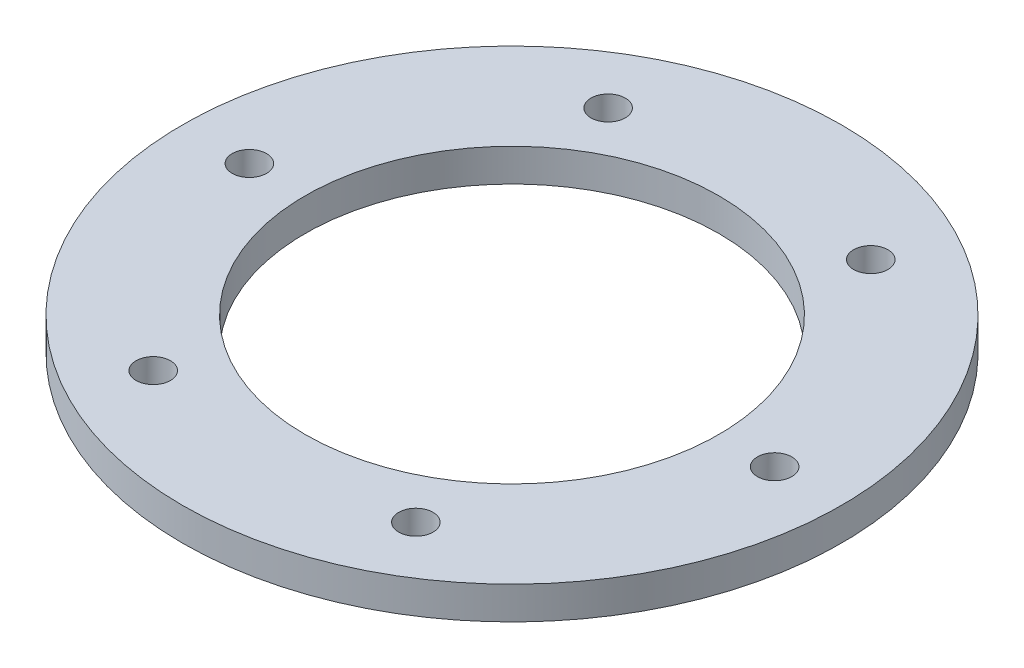
ISO-10303-21;
HEADER;
FILE_DESCRIPTION(('STEP AP214'),'2;1');
FILE_NAME('part.step','',(''),(''),'','','');
FILE_SCHEMA(('AUTOMOTIVE_DESIGN { 1 0 10303 214 1 1 1 1 }'));
ENDSEC;
DATA;
#1=APPLICATION_CONTEXT('core data for automotive mechanical design processes');
#2=APPLICATION_PROTOCOL_DEFINITION('international standard','automotive_design',2000,#1);
#3=PRODUCT_CONTEXT('',#1,'mechanical');
#4=PRODUCT('Part','Part','',(#3));
#5=PRODUCT_RELATED_PRODUCT_CATEGORY('part','',(#4));
#6=PRODUCT_DEFINITION_FORMATION('','',#4);
#7=PRODUCT_DEFINITION_CONTEXT('part definition',#1,'design');
#8=PRODUCT_DEFINITION('design','',#6,#7);
#9=PRODUCT_DEFINITION_SHAPE('','',#8);
#10=(LENGTH_UNIT() NAMED_UNIT(*) SI_UNIT(.MILLI.,.METRE.));
#11=(NAMED_UNIT(*) PLANE_ANGLE_UNIT() SI_UNIT($,.RADIAN.));
#12=(NAMED_UNIT(*) SI_UNIT($,.STERADIAN.) SOLID_ANGLE_UNIT());
#13=UNCERTAINTY_MEASURE_WITH_UNIT(LENGTH_MEASURE(1.E-05),#10,'distance_accuracy_value','');
#14=(GEOMETRIC_REPRESENTATION_CONTEXT(3) GLOBAL_UNCERTAINTY_ASSIGNED_CONTEXT((#13)) GLOBAL_UNIT_ASSIGNED_CONTEXT((#10,
#11,#12)) REPRESENTATION_CONTEXT('',''));
#15=CARTESIAN_POINT('',(0.,0.,0.));
#16=DIRECTION('',(0.,0.,1.));
#17=DIRECTION('',(1.,0.,0.));
#18=AXIS2_PLACEMENT_3D('',#15,#16,#17);
#19=CARTESIAN_POINT('',(0.,0.,0.));
#20=DIRECTION('',(0.,-1.,0.));
#21=DIRECTION('',(0.,0.,-1.));
#22=AXIS2_PLACEMENT_3D('',#19,#20,#21);
#23=CYLINDRICAL_SURFACE('',#22,25.28);
#24=CARTESIAN_POINT('',(0.,0.,0.));
#25=DIRECTION('',(0.,-1.,0.));
#26=DIRECTION('',(0.,0.,-1.));
#27=AXIS2_PLACEMENT_3D('',#24,#25,#26);
#28=CIRCLE('',#27,25.28);
#29=CARTESIAN_POINT('',(0.,0.,-25.28));
#30=VERTEX_POINT('',#29);
#31=EDGE_CURVE('E72',#30,#30,#28,.T.);
#32=ORIENTED_EDGE('',*,*,#31,.T.);
#33=EDGE_LOOP('',(#32));
#34=FACE_BOUND('',#33,.T.);
#35=CARTESIAN_POINT('',(0.,4.,0.));
#36=DIRECTION('',(0.,-1.,0.));
#37=DIRECTION('',(0.,0.,-1.));
#38=AXIS2_PLACEMENT_3D('',#35,#36,#37);
#39=CIRCLE('',#38,25.28);
#40=CARTESIAN_POINT('',(0.,4.,-25.28));
#41=VERTEX_POINT('',#40);
#42=EDGE_CURVE('E10',#41,#41,#39,.T.);
#43=ORIENTED_EDGE('',*,*,#42,.F.);
#44=EDGE_LOOP('',(#43));
#45=FACE_BOUND('',#44,.T.);
#46=ADVANCED_FACE('F39',(#34,#45),#23,.F.);
#47=CARTESIAN_POINT('',(25.28,4.,0.));
#48=DIRECTION('',(0.,1.,0.));
#49=DIRECTION('',(0.,0.,1.));
#50=AXIS2_PLACEMENT_3D('',#47,#48,#49);
#51=PLANE('',#50);
#52=CARTESIAN_POINT('',(-32.1,4.,0.));
#53=DIRECTION('',(0.,1.,0.));
#54=DIRECTION('',(0.,0.,1.));
#55=AXIS2_PLACEMENT_3D('',#52,#53,#54);
#56=CIRCLE('',#55,2.1);
#57=CARTESIAN_POINT('',(-32.1,4.,2.1));
#58=VERTEX_POINT('',#57);
#59=EDGE_CURVE('E59',#58,#58,#56,.T.);
#60=ORIENTED_EDGE('',*,*,#59,.F.);
#61=EDGE_LOOP('',(#60));
#62=FACE_BOUND('',#61,.T.);
#63=CARTESIAN_POINT('',(-16.05,4.,27.7994154614805));
#64=DIRECTION('',(0.,1.,0.));
#65=DIRECTION('',(0.,0.,1.));
#66=AXIS2_PLACEMENT_3D('',#63,#64,#65);
#67=CIRCLE('',#66,2.1);
#68=CARTESIAN_POINT('',(-16.05,4.,29.8994154614805));
#69=VERTEX_POINT('',#68);
#70=EDGE_CURVE('E85',#69,#69,#67,.T.);
#71=ORIENTED_EDGE('',*,*,#70,.F.);
#72=EDGE_LOOP('',(#71));
#73=FACE_BOUND('',#72,.T.);
#74=CARTESIAN_POINT('',(16.05,4.,27.7994154614805));
#75=DIRECTION('',(0.,1.,0.));
#76=DIRECTION('',(0.,0.,1.));
#77=AXIS2_PLACEMENT_3D('',#74,#75,#76);
#78=CIRCLE('',#77,2.1);
#79=CARTESIAN_POINT('',(16.05,4.,29.8994154614805));
#80=VERTEX_POINT('',#79);
#81=EDGE_CURVE('E81',#80,#80,#78,.T.);
#82=ORIENTED_EDGE('',*,*,#81,.F.);
#83=EDGE_LOOP('',(#82));
#84=FACE_BOUND('',#83,.T.);
#85=CARTESIAN_POINT('',(32.1,4.,0.));
#86=DIRECTION('',(0.,1.,0.));
#87=DIRECTION('',(0.,0.,1.));
#88=AXIS2_PLACEMENT_3D('',#85,#86,#87);
#89=CIRCLE('',#88,2.09999999999999);
#90=CARTESIAN_POINT('',(32.1,4.,2.09999999999999));
#91=VERTEX_POINT('',#90);
#92=EDGE_CURVE('E84',#91,#91,#89,.T.);
#93=ORIENTED_EDGE('',*,*,#92,.F.);
#94=EDGE_LOOP('',(#93));
#95=FACE_BOUND('',#94,.T.);
#96=CARTESIAN_POINT('',(16.05,4.,-27.7994154614805));
#97=DIRECTION('',(0.,1.,0.));
#98=DIRECTION('',(0.,0.,1.));
#99=AXIS2_PLACEMENT_3D('',#96,#97,#98);
#100=CIRCLE('',#99,2.1);
#101=CARTESIAN_POINT('',(16.05,4.,-25.6994154614805));
#102=VERTEX_POINT('',#101);
#103=EDGE_CURVE('E88',#102,#102,#100,.T.);
#104=ORIENTED_EDGE('',*,*,#103,.F.);
#105=EDGE_LOOP('',(#104));
#106=FACE_BOUND('',#105,.T.);
#107=CARTESIAN_POINT('',(-16.05,4.,-27.7994154614805));
#108=DIRECTION('',(0.,1.,0.));
#109=DIRECTION('',(0.,0.,1.));
#110=AXIS2_PLACEMENT_3D('',#107,#108,#109);
#111=CIRCLE('',#110,2.1);
#112=CARTESIAN_POINT('',(-16.05,4.,-25.6994154614805));
#113=VERTEX_POINT('',#112);
#114=EDGE_CURVE('E91',#113,#113,#111,.T.);
#115=ORIENTED_EDGE('',*,*,#114,.F.);
#116=EDGE_LOOP('',(#115));
#117=FACE_BOUND('',#116,.T.);
#118=ORIENTED_EDGE('',*,*,#42,.T.);
#119=EDGE_LOOP('',(#118));
#120=FACE_BOUND('',#119,.T.);
#121=CARTESIAN_POINT('',(0.,4.,0.));
#122=DIRECTION('',(0.,-1.,0.));
#123=DIRECTION('',(0.,0.,-1.));
#124=AXIS2_PLACEMENT_3D('',#121,#122,#123);
#125=CIRCLE('',#124,40.28);
#126=CARTESIAN_POINT('',(0.,4.,-40.28));
#127=VERTEX_POINT('',#126);
#128=EDGE_CURVE('E46',#127,#127,#125,.T.);
#129=ORIENTED_EDGE('',*,*,#128,.F.);
#130=EDGE_LOOP('',(#129));
#131=FACE_BOUND('',#130,.T.);
#132=ADVANCED_FACE('F101',(#62,#73,#84,#95,#106,#117,#120,#131),#51,.T.);
#133=CARTESIAN_POINT('',(0.,0.,0.));
#134=DIRECTION('',(0.,-1.,0.));
#135=DIRECTION('',(0.,0.,-1.));
#136=AXIS2_PLACEMENT_3D('',#133,#134,#135);
#137=CYLINDRICAL_SURFACE('',#136,40.28);
#138=ORIENTED_EDGE('',*,*,#128,.T.);
#139=EDGE_LOOP('',(#138));
#140=FACE_BOUND('',#139,.T.);
#141=CARTESIAN_POINT('',(0.,0.,0.));
#142=DIRECTION('',(0.,-1.,0.));
#143=DIRECTION('',(0.,0.,-1.));
#144=AXIS2_PLACEMENT_3D('',#141,#142,#143);
#145=CIRCLE('',#144,40.28);
#146=CARTESIAN_POINT('',(0.,0.,-40.28));
#147=VERTEX_POINT('',#146);
#148=EDGE_CURVE('E51',#147,#147,#145,.T.);
#149=ORIENTED_EDGE('',*,*,#148,.F.);
#150=EDGE_LOOP('',(#149));
#151=FACE_BOUND('',#150,.T.);
#152=ADVANCED_FACE('F104',(#140,#151),#137,.T.);
#153=CARTESIAN_POINT('',(25.28,0.,0.));
#154=DIRECTION('',(0.,-1.,0.));
#155=DIRECTION('',(0.,0.,-1.));
#156=AXIS2_PLACEMENT_3D('',#153,#154,#155);
#157=PLANE('',#156);
#158=CARTESIAN_POINT('',(-32.1,0.,0.));
#159=DIRECTION('',(0.,-1.,0.));
#160=DIRECTION('',(0.,0.,-1.));
#161=AXIS2_PLACEMENT_3D('',#158,#159,#160);
#162=CIRCLE('',#161,2.1);
#163=CARTESIAN_POINT('',(-32.1,0.,-2.1));
#164=VERTEX_POINT('',#163);
#165=EDGE_CURVE('E42',#164,#164,#162,.T.);
#166=ORIENTED_EDGE('',*,*,#165,.F.);
#167=EDGE_LOOP('',(#166));
#168=FACE_BOUND('',#167,.T.);
#169=CARTESIAN_POINT('',(-16.05,0.,27.7994154614805));
#170=DIRECTION('',(0.,-1.,0.));
#171=DIRECTION('',(0.,0.,-1.));
#172=AXIS2_PLACEMENT_3D('',#169,#170,#171);
#173=CIRCLE('',#172,2.1);
#174=CARTESIAN_POINT('',(-16.05,0.,25.6994154614805));
#175=VERTEX_POINT('',#174);
#176=EDGE_CURVE('E67',#175,#175,#173,.T.);
#177=ORIENTED_EDGE('',*,*,#176,.F.);
#178=EDGE_LOOP('',(#177));
#179=FACE_BOUND('',#178,.T.);
#180=CARTESIAN_POINT('',(16.05,0.,27.7994154614805));
#181=DIRECTION('',(0.,-1.,0.));
#182=DIRECTION('',(0.,0.,-1.));
#183=AXIS2_PLACEMENT_3D('',#180,#181,#182);
#184=CIRCLE('',#183,2.1);
#185=CARTESIAN_POINT('',(16.05,0.,25.6994154614805));
#186=VERTEX_POINT('',#185);
#187=EDGE_CURVE('E65',#186,#186,#184,.T.);
#188=ORIENTED_EDGE('',*,*,#187,.F.);
#189=EDGE_LOOP('',(#188));
#190=FACE_BOUND('',#189,.T.);
#191=CARTESIAN_POINT('',(32.1,0.,0.));
#192=DIRECTION('',(0.,-1.,0.));
#193=DIRECTION('',(0.,0.,-1.));
#194=AXIS2_PLACEMENT_3D('',#191,#192,#193);
#195=CIRCLE('',#194,2.09999999999999);
#196=CARTESIAN_POINT('',(32.1,0.,-2.09999999999999));
#197=VERTEX_POINT('',#196);
#198=EDGE_CURVE('E62',#197,#197,#195,.T.);
#199=ORIENTED_EDGE('',*,*,#198,.F.);
#200=EDGE_LOOP('',(#199));
#201=FACE_BOUND('',#200,.T.);
#202=CARTESIAN_POINT('',(16.05,0.,-27.7994154614805));
#203=DIRECTION('',(0.,-1.,0.));
#204=DIRECTION('',(0.,0.,-1.));
#205=AXIS2_PLACEMENT_3D('',#202,#203,#204);
#206=CIRCLE('',#205,2.1);
#207=CARTESIAN_POINT('',(16.05,0.,-29.8994154614805));
#208=VERTEX_POINT('',#207);
#209=EDGE_CURVE('E58',#208,#208,#206,.T.);
#210=ORIENTED_EDGE('',*,*,#209,.F.);
#211=EDGE_LOOP('',(#210));
#212=FACE_BOUND('',#211,.T.);
#213=CARTESIAN_POINT('',(-16.05,0.,-27.7994154614805));
#214=DIRECTION('',(0.,-1.,0.));
#215=DIRECTION('',(0.,0.,-1.));
#216=AXIS2_PLACEMENT_3D('',#213,#214,#215);
#217=CIRCLE('',#216,2.1);
#218=CARTESIAN_POINT('',(-16.05,0.,-29.8994154614805));
#219=VERTEX_POINT('',#218);
#220=EDGE_CURVE('E55',#219,#219,#217,.T.);
#221=ORIENTED_EDGE('',*,*,#220,.F.);
#222=EDGE_LOOP('',(#221));
#223=FACE_BOUND('',#222,.T.);
#224=ORIENTED_EDGE('',*,*,#148,.T.);
#225=EDGE_LOOP('',(#224));
#226=FACE_BOUND('',#225,.T.);
#227=ORIENTED_EDGE('',*,*,#31,.F.);
#228=EDGE_LOOP('',(#227));
#229=FACE_BOUND('',#228,.T.);
#230=ADVANCED_FACE('F119',(#168,#179,#190,#201,#212,#223,#226,#229),#157,.T.);
#231=CARTESIAN_POINT('',(-16.05,-6.,-27.7994154614805));
#232=DIRECTION('',(0.,1.,0.));
#233=DIRECTION('',(0.,0.,1.));
#234=AXIS2_PLACEMENT_3D('',#231,#232,#233);
#235=CYLINDRICAL_SURFACE('',#234,2.1);
#236=ORIENTED_EDGE('',*,*,#220,.T.);
#237=EDGE_LOOP('',(#236));
#238=FACE_BOUND('',#237,.T.);
#239=ORIENTED_EDGE('',*,*,#114,.T.);
#240=EDGE_LOOP('',(#239));
#241=FACE_BOUND('',#240,.T.);
#242=ADVANCED_FACE('F125',(#238,#241),#235,.F.);
#243=CARTESIAN_POINT('',(16.05,-6.,-27.7994154614805));
#244=DIRECTION('',(0.,1.,0.));
#245=DIRECTION('',(0.,0.,1.));
#246=AXIS2_PLACEMENT_3D('',#243,#244,#245);
#247=CYLINDRICAL_SURFACE('',#246,2.1);
#248=ORIENTED_EDGE('',*,*,#209,.T.);
#249=EDGE_LOOP('',(#248));
#250=FACE_BOUND('',#249,.T.);
#251=ORIENTED_EDGE('',*,*,#103,.T.);
#252=EDGE_LOOP('',(#251));
#253=FACE_BOUND('',#252,.T.);
#254=ADVANCED_FACE('F131',(#250,#253),#247,.F.);
#255=CARTESIAN_POINT('',(32.1,-6.,0.));
#256=DIRECTION('',(0.,1.,0.));
#257=DIRECTION('',(0.,0.,1.));
#258=AXIS2_PLACEMENT_3D('',#255,#256,#257);
#259=CYLINDRICAL_SURFACE('',#258,2.09999999999999);
#260=ORIENTED_EDGE('',*,*,#198,.T.);
#261=EDGE_LOOP('',(#260));
#262=FACE_BOUND('',#261,.T.);
#263=ORIENTED_EDGE('',*,*,#92,.T.);
#264=EDGE_LOOP('',(#263));
#265=FACE_BOUND('',#264,.T.);
#266=ADVANCED_FACE('F170',(#262,#265),#259,.F.);
#267=CARTESIAN_POINT('',(16.05,-6.,27.7994154614805));
#268=DIRECTION('',(0.,1.,0.));
#269=DIRECTION('',(0.,0.,1.));
#270=AXIS2_PLACEMENT_3D('',#267,#268,#269);
#271=CYLINDRICAL_SURFACE('',#270,2.1);
#272=ORIENTED_EDGE('',*,*,#187,.T.);
#273=EDGE_LOOP('',(#272));
#274=FACE_BOUND('',#273,.T.);
#275=ORIENTED_EDGE('',*,*,#81,.T.);
#276=EDGE_LOOP('',(#275));
#277=FACE_BOUND('',#276,.T.);
#278=ADVANCED_FACE('F179',(#274,#277),#271,.F.);
#279=CARTESIAN_POINT('',(-16.05,-6.,27.7994154614805));
#280=DIRECTION('',(0.,1.,0.));
#281=DIRECTION('',(0.,0.,1.));
#282=AXIS2_PLACEMENT_3D('',#279,#280,#281);
#283=CYLINDRICAL_SURFACE('',#282,2.1);
#284=ORIENTED_EDGE('',*,*,#176,.T.);
#285=EDGE_LOOP('',(#284));
#286=FACE_BOUND('',#285,.T.);
#287=ORIENTED_EDGE('',*,*,#70,.T.);
#288=EDGE_LOOP('',(#287));
#289=FACE_BOUND('',#288,.T.);
#290=ADVANCED_FACE('F188',(#286,#289),#283,.F.);
#291=CARTESIAN_POINT('',(-32.1,-6.,0.));
#292=DIRECTION('',(0.,1.,0.));
#293=DIRECTION('',(0.,0.,1.));
#294=AXIS2_PLACEMENT_3D('',#291,#292,#293);
#295=CYLINDRICAL_SURFACE('',#294,2.1);
#296=ORIENTED_EDGE('',*,*,#165,.T.);
#297=EDGE_LOOP('',(#296));
#298=FACE_BOUND('',#297,.T.);
#299=ORIENTED_EDGE('',*,*,#59,.T.);
#300=EDGE_LOOP('',(#299));
#301=FACE_BOUND('',#300,.T.);
#302=ADVANCED_FACE('F99',(#298,#301),#295,.F.);
#303=CLOSED_SHELL('',(#46,#132,#152,#230,#242,#254,#266,#278,#290,#302));
#304=MANIFOLD_SOLID_BREP('B2',#303);
#305=ADVANCED_BREP_SHAPE_REPRESENTATION('',(#18,#304),#14);
#306=SHAPE_DEFINITION_REPRESENTATION(#9,#305);
ENDSEC;
END-ISO-10303-21;
